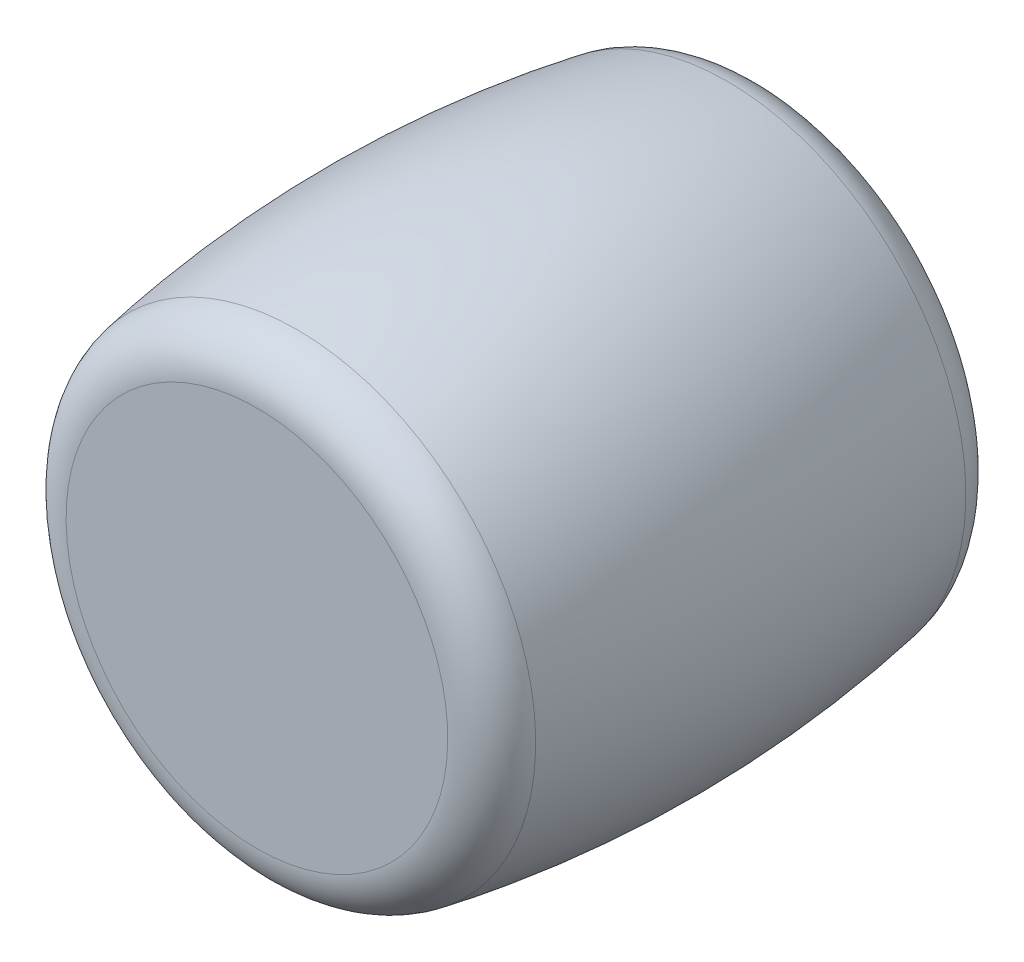
ISO-10303-21;
HEADER;
FILE_DESCRIPTION(('STEP AP214'),'2;1');
FILE_NAME('part.step','',(''),(''),'','','');
FILE_SCHEMA(('AUTOMOTIVE_DESIGN { 1 0 10303 214 1 1 1 1 }'));
ENDSEC;
DATA;
#1=APPLICATION_CONTEXT('core data for automotive mechanical design processes');
#2=APPLICATION_PROTOCOL_DEFINITION('international standard','automotive_design',2000,#1);
#3=PRODUCT_CONTEXT('',#1,'mechanical');
#4=PRODUCT('Part','Part','',(#3));
#5=PRODUCT_RELATED_PRODUCT_CATEGORY('part','',(#4));
#6=PRODUCT_DEFINITION_FORMATION('','',#4);
#7=PRODUCT_DEFINITION_CONTEXT('part definition',#1,'design');
#8=PRODUCT_DEFINITION('design','',#6,#7);
#9=PRODUCT_DEFINITION_SHAPE('','',#8);
#10=(LENGTH_UNIT() NAMED_UNIT(*) SI_UNIT(.MILLI.,.METRE.));
#11=(NAMED_UNIT(*) PLANE_ANGLE_UNIT() SI_UNIT($,.RADIAN.));
#12=(NAMED_UNIT(*) SI_UNIT($,.STERADIAN.) SOLID_ANGLE_UNIT());
#13=UNCERTAINTY_MEASURE_WITH_UNIT(LENGTH_MEASURE(1.E-05),#10,'distance_accuracy_value','');
#14=(GEOMETRIC_REPRESENTATION_CONTEXT(3) GLOBAL_UNCERTAINTY_ASSIGNED_CONTEXT((#13)) GLOBAL_UNIT_ASSIGNED_CONTEXT((#10,
#11,#12)) REPRESENTATION_CONTEXT('',''));
#15=CARTESIAN_POINT('',(0.,0.,0.));
#16=DIRECTION('',(0.,0.,1.));
#17=DIRECTION('',(1.,0.,0.));
#18=AXIS2_PLACEMENT_3D('',#15,#16,#17);
#19=CARTESIAN_POINT('',(0.,-2.375,0.));
#20=DIRECTION('',(0.,0.,-1.));
#21=DIRECTION('',(0.,1.,0.));
#22=AXIS2_PLACEMENT_3D('',#19,#20,#21);
#23=DEGENERATE_TOROIDAL_SURFACE('',#22,19.9481780704569,25.25,.F.);
#24=CARTESIAN_POINT('',(0.,-2.375,-4.42525773195876));
#25=DIRECTION('',(0.,0.,1.));
#26=DIRECTION('',(0.,-1.,0.));
#27=AXIS2_PLACEMENT_3D('',#24,#25,#26);
#28=CIRCLE('',#27,4.91101729073163);
#29=CARTESIAN_POINT('',(0.,-7.28601729073162,-4.42525773195876));
#30=VERTEX_POINT('',#29);
#31=EDGE_CURVE('E40',#30,#30,#28,.T.);
#32=ORIENTED_EDGE('',*,*,#31,.T.);
#33=EDGE_LOOP('',(#32));
#34=FACE_BOUND('',#33,.T.);
#35=CARTESIAN_POINT('',(0.,-2.375,4.42525773195876));
#36=DIRECTION('',(0.,0.,-1.));
#37=DIRECTION('',(0.,1.,0.));
#38=AXIS2_PLACEMENT_3D('',#35,#36,#37);
#39=CIRCLE('',#38,4.91101729073163);
#40=CARTESIAN_POINT('',(0.,2.53601729073163,4.42525773195876));
#41=VERTEX_POINT('',#40);
#42=EDGE_CURVE('E44',#41,#41,#39,.T.);
#43=ORIENTED_EDGE('',*,*,#42,.T.);
#44=EDGE_LOOP('',(#43));
#45=FACE_BOUND('',#44,.T.);
#46=ADVANCED_FACE('F33',(#34,#45),#23,.F.);
#47=CARTESIAN_POINT('',(0.,0.275910964771531,5.25));
#48=DIRECTION('',(0.,0.,1.));
#49=DIRECTION('',(0.,-1.,0.));
#50=AXIS2_PLACEMENT_3D('',#47,#48,#49);
#51=PLANE('',#50);
#52=CARTESIAN_POINT('',(0.,-2.375,5.25));
#53=DIRECTION('',(0.,0.,1.));
#54=DIRECTION('',(0.,-1.,0.));
#55=AXIS2_PLACEMENT_3D('',#52,#53,#54);
#56=CIRCLE('',#55,3.9264947021697);
#57=CARTESIAN_POINT('',(0.,-6.3014947021697,5.25));
#58=VERTEX_POINT('',#57);
#59=EDGE_CURVE('E10',#58,#58,#56,.T.);
#60=ORIENTED_EDGE('',*,*,#59,.T.);
#61=EDGE_LOOP('',(#60));
#62=FACE_BOUND('',#61,.T.);
#63=ADVANCED_FACE('F64',(#62),#51,.T.);
#64=CARTESIAN_POINT('',(0.,0.275910964771531,-5.25));
#65=DIRECTION('',(0.,0.,1.));
#66=DIRECTION('',(0.,-1.,0.));
#67=AXIS2_PLACEMENT_3D('',#64,#65,#66);
#68=PLANE('',#67);
#69=CARTESIAN_POINT('',(0.,-2.375,-5.25));
#70=DIRECTION('',(0.,0.,1.));
#71=DIRECTION('',(0.,-1.,0.));
#72=AXIS2_PLACEMENT_3D('',#69,#70,#71);
#73=CIRCLE('',#72,3.9264947021697);
#74=CARTESIAN_POINT('',(0.,-6.3014947021697,-5.25));
#75=VERTEX_POINT('',#74);
#76=EDGE_CURVE('E48',#75,#75,#73,.F.);
#77=ORIENTED_EDGE('',*,*,#76,.T.);
#78=EDGE_LOOP('',(#77));
#79=FACE_BOUND('',#78,.T.);
#80=ADVANCED_FACE('F54',(#79),#68,.F.);
#81=CARTESIAN_POINT('',(0.,-2.375,-4.25));
#82=DIRECTION('',(0.,0.,1.));
#83=DIRECTION('',(0.,-1.,0.));
#84=AXIS2_PLACEMENT_3D('',#81,#82,#83);
#85=TOROIDAL_SURFACE('',#84,3.9264947021697,1.);
#86=ORIENTED_EDGE('',*,*,#31,.F.);
#87=EDGE_LOOP('',(#86));
#88=FACE_BOUND('',#87,.T.);
#89=ORIENTED_EDGE('',*,*,#76,.F.);
#90=EDGE_LOOP('',(#89));
#91=FACE_BOUND('',#90,.T.);
#92=ADVANCED_FACE('F56',(#88,#91),#85,.T.);
#93=CARTESIAN_POINT('',(0.,-2.375,4.25));
#94=DIRECTION('',(0.,0.,1.));
#95=DIRECTION('',(0.,-1.,0.));
#96=AXIS2_PLACEMENT_3D('',#93,#94,#95);
#97=TOROIDAL_SURFACE('',#96,3.9264947021697,1.);
#98=ORIENTED_EDGE('',*,*,#59,.F.);
#99=EDGE_LOOP('',(#98));
#100=FACE_BOUND('',#99,.T.);
#101=ORIENTED_EDGE('',*,*,#42,.F.);
#102=EDGE_LOOP('',(#101));
#103=FACE_BOUND('',#102,.T.);
#104=ADVANCED_FACE('F35',(#100,#103),#97,.T.);
#105=CLOSED_SHELL('',(#46,#63,#80,#92,#104));
#106=MANIFOLD_SOLID_BREP('B2',#105);
#107=ADVANCED_BREP_SHAPE_REPRESENTATION('',(#18,#106),#14);
#108=SHAPE_DEFINITION_REPRESENTATION(#9,#107);
ENDSEC;
END-ISO-10303-21;
